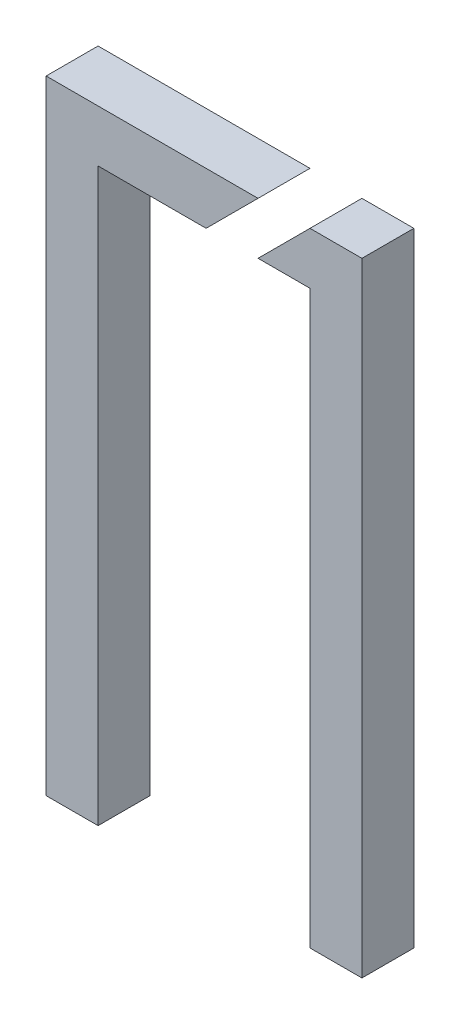
ISO-10303-21;
HEADER;
FILE_DESCRIPTION(('STEP AP214'),'2;1');
FILE_NAME('part.step','',(''),(''),'','','');
FILE_SCHEMA(('AUTOMOTIVE_DESIGN { 1 0 10303 214 1 1 1 1 }'));
ENDSEC;
DATA;
#1=APPLICATION_CONTEXT('core data for automotive mechanical design processes');
#2=APPLICATION_PROTOCOL_DEFINITION('international standard','automotive_design',2000,#1);
#3=PRODUCT_CONTEXT('',#1,'mechanical');
#4=PRODUCT('Part','Part','',(#3));
#5=PRODUCT_RELATED_PRODUCT_CATEGORY('part','',(#4));
#6=PRODUCT_DEFINITION_FORMATION('','',#4);
#7=PRODUCT_DEFINITION_CONTEXT('part definition',#1,'design');
#8=PRODUCT_DEFINITION('design','',#6,#7);
#9=PRODUCT_DEFINITION_SHAPE('','',#8);
#10=(LENGTH_UNIT() NAMED_UNIT(*) SI_UNIT(.MILLI.,.METRE.));
#11=(NAMED_UNIT(*) PLANE_ANGLE_UNIT() SI_UNIT($,.RADIAN.));
#12=(NAMED_UNIT(*) SI_UNIT($,.STERADIAN.) SOLID_ANGLE_UNIT());
#13=UNCERTAINTY_MEASURE_WITH_UNIT(LENGTH_MEASURE(1.E-05),#10,'distance_accuracy_value','');
#14=(GEOMETRIC_REPRESENTATION_CONTEXT(3) GLOBAL_UNCERTAINTY_ASSIGNED_CONTEXT((#13)) GLOBAL_UNIT_ASSIGNED_CONTEXT((#10,
#11,#12)) REPRESENTATION_CONTEXT('',''));
#15=CARTESIAN_POINT('',(0.,0.,0.));
#16=DIRECTION('',(0.,0.,1.));
#17=DIRECTION('',(1.,0.,0.));
#18=AXIS2_PLACEMENT_3D('',#15,#16,#17);
#19=CARTESIAN_POINT('',(2.04,5.5,0.5));
#20=DIRECTION('',(0.707106781186548,-0.707106781186547,0.));
#21=DIRECTION('',(0.707106781186547,0.707106781186548,0.));
#22=AXIS2_PLACEMENT_3D('',#19,#20,#21);
#23=PLANE('',#22);
#24=DIRECTION('',(-0.707106781186547,-0.707106781186548,0.));
#25=VECTOR('',#24,1.);
#26=CARTESIAN_POINT('',(2.04,5.5,0.));
#27=LINE('',#26,#25);
#28=CARTESIAN_POINT('',(2.54,6.,0.));
#29=VERTEX_POINT('',#28);
#30=CARTESIAN_POINT('',(2.04,5.5,0.));
#31=VERTEX_POINT('',#30);
#32=EDGE_CURVE('E127',#29,#31,#27,.T.);
#33=ORIENTED_EDGE('',*,*,#32,.T.);
#34=DIRECTION('',(0.,0.,-1.));
#35=VECTOR('',#34,1.);
#36=CARTESIAN_POINT('',(2.04,5.5,0.5));
#37=LINE('',#36,#35);
#38=CARTESIAN_POINT('',(2.04,5.5,0.5));
#39=VERTEX_POINT('',#38);
#40=EDGE_CURVE('E12',#39,#31,#37,.T.);
#41=ORIENTED_EDGE('',*,*,#40,.F.);
#42=DIRECTION('',(-0.707106781186547,-0.707106781186548,0.));
#43=VECTOR('',#42,1.);
#44=CARTESIAN_POINT('',(2.04,5.5,0.5));
#45=LINE('',#44,#43);
#46=CARTESIAN_POINT('',(2.54,6.,0.5));
#47=VERTEX_POINT('',#46);
#48=EDGE_CURVE('E137',#47,#39,#45,.T.);
#49=ORIENTED_EDGE('',*,*,#48,.F.);
#50=DIRECTION('',(0.,0.,-1.));
#51=VECTOR('',#50,1.);
#52=CARTESIAN_POINT('',(2.54,6.,0.5));
#53=LINE('',#52,#51);
#54=EDGE_CURVE('E123',#47,#29,#53,.T.);
#55=ORIENTED_EDGE('',*,*,#54,.T.);
#56=EDGE_LOOP('',(#33,#41,#49,#55));
#57=FACE_BOUND('',#56,.T.);
#58=ADVANCED_FACE('F43',(#57),#23,.F.);
#59=CARTESIAN_POINT('',(2.54,5.5,0.5));
#60=DIRECTION('',(0.,1.,0.));
#61=DIRECTION('',(0.,0.,1.));
#62=AXIS2_PLACEMENT_3D('',#59,#60,#61);
#63=PLANE('',#62);
#64=DIRECTION('',(1.,0.,0.));
#65=VECTOR('',#64,1.);
#66=CARTESIAN_POINT('',(2.54,5.5,0.));
#67=LINE('',#66,#65);
#68=CARTESIAN_POINT('',(2.54,5.5,0.));
#69=VERTEX_POINT('',#68);
#70=EDGE_CURVE('E130',#31,#69,#67,.T.);
#71=ORIENTED_EDGE('',*,*,#70,.T.);
#72=DIRECTION('',(0.,0.,-1.));
#73=VECTOR('',#72,1.);
#74=CARTESIAN_POINT('',(2.54,5.5,0.5));
#75=LINE('',#74,#73);
#76=CARTESIAN_POINT('',(2.54,5.5,0.5));
#77=VERTEX_POINT('',#76);
#78=EDGE_CURVE('E51',#77,#69,#75,.T.);
#79=ORIENTED_EDGE('',*,*,#78,.F.);
#80=DIRECTION('',(1.,0.,0.));
#81=VECTOR('',#80,1.);
#82=CARTESIAN_POINT('',(2.54,5.5,0.5));
#83=LINE('',#82,#81);
#84=EDGE_CURVE('E96',#39,#77,#83,.T.);
#85=ORIENTED_EDGE('',*,*,#84,.F.);
#86=ORIENTED_EDGE('',*,*,#40,.T.);
#87=EDGE_LOOP('',(#71,#79,#85,#86));
#88=FACE_BOUND('',#87,.T.);
#89=ADVANCED_FACE('F161',(#88),#63,.F.);
#90=CARTESIAN_POINT('',(2.54,0.,0.5));
#91=DIRECTION('',(1.,0.,0.));
#92=DIRECTION('',(0.,0.,-1.));
#93=AXIS2_PLACEMENT_3D('',#90,#91,#92);
#94=PLANE('',#93);
#95=DIRECTION('',(0.,-1.,0.));
#96=VECTOR('',#95,1.);
#97=CARTESIAN_POINT('',(2.54,0.,0.));
#98=LINE('',#97,#96);
#99=CARTESIAN_POINT('',(2.54,0.,0.));
#100=VERTEX_POINT('',#99);
#101=EDGE_CURVE('E132',#69,#100,#98,.T.);
#102=ORIENTED_EDGE('',*,*,#101,.T.);
#103=DIRECTION('',(0.,0.,-1.));
#104=VECTOR('',#103,1.);
#105=CARTESIAN_POINT('',(2.54,0.,0.5));
#106=LINE('',#105,#104);
#107=CARTESIAN_POINT('',(2.54,0.,0.5));
#108=VERTEX_POINT('',#107);
#109=EDGE_CURVE('E118',#108,#100,#106,.T.);
#110=ORIENTED_EDGE('',*,*,#109,.F.);
#111=DIRECTION('',(0.,-1.,0.));
#112=VECTOR('',#111,1.);
#113=CARTESIAN_POINT('',(2.54,0.,0.5));
#114=LINE('',#113,#112);
#115=EDGE_CURVE('E109',#77,#108,#114,.T.);
#116=ORIENTED_EDGE('',*,*,#115,.F.);
#117=ORIENTED_EDGE('',*,*,#78,.T.);
#118=EDGE_LOOP('',(#102,#110,#116,#117));
#119=FACE_BOUND('',#118,.T.);
#120=ADVANCED_FACE('F143',(#119),#94,.F.);
#121=CARTESIAN_POINT('',(3.04,0.,0.5));
#122=DIRECTION('',(0.,1.,0.));
#123=DIRECTION('',(-1.,0.,0.));
#124=AXIS2_PLACEMENT_3D('',#121,#122,#123);
#125=PLANE('',#124);
#126=DIRECTION('',(1.,0.,0.));
#127=VECTOR('',#126,1.);
#128=CARTESIAN_POINT('',(3.04,0.,0.));
#129=LINE('',#128,#127);
#130=CARTESIAN_POINT('',(3.04,0.,0.));
#131=VERTEX_POINT('',#130);
#132=EDGE_CURVE('E117',#100,#131,#129,.T.);
#133=ORIENTED_EDGE('',*,*,#132,.T.);
#134=DIRECTION('',(0.,0.,-1.));
#135=VECTOR('',#134,1.);
#136=CARTESIAN_POINT('',(3.04,0.,0.5));
#137=LINE('',#136,#135);
#138=CARTESIAN_POINT('',(3.04,0.,0.5));
#139=VERTEX_POINT('',#138);
#140=EDGE_CURVE('E114',#139,#131,#137,.T.);
#141=ORIENTED_EDGE('',*,*,#140,.F.);
#142=DIRECTION('',(1.,0.,0.));
#143=VECTOR('',#142,1.);
#144=CARTESIAN_POINT('',(3.04,0.,0.5));
#145=LINE('',#144,#143);
#146=EDGE_CURVE('E103',#108,#139,#145,.T.);
#147=ORIENTED_EDGE('',*,*,#146,.F.);
#148=ORIENTED_EDGE('',*,*,#109,.T.);
#149=EDGE_LOOP('',(#133,#141,#147,#148));
#150=FACE_BOUND('',#149,.T.);
#151=ADVANCED_FACE('F115',(#150),#125,.F.);
#152=CARTESIAN_POINT('',(3.04,6.,0.5));
#153=DIRECTION('',(-1.,0.,0.));
#154=DIRECTION('',(0.,-1.,0.));
#155=AXIS2_PLACEMENT_3D('',#152,#153,#154);
#156=PLANE('',#155);
#157=DIRECTION('',(0.,1.,0.));
#158=VECTOR('',#157,1.);
#159=CARTESIAN_POINT('',(3.04,6.,0.));
#160=LINE('',#159,#158);
#161=CARTESIAN_POINT('',(3.04,6.,0.));
#162=VERTEX_POINT('',#161);
#163=EDGE_CURVE('E82',#131,#162,#160,.T.);
#164=ORIENTED_EDGE('',*,*,#163,.T.);
#165=DIRECTION('',(0.,0.,-1.));
#166=VECTOR('',#165,1.);
#167=CARTESIAN_POINT('',(3.04,6.,0.5));
#168=LINE('',#167,#166);
#169=CARTESIAN_POINT('',(3.04,6.,0.5));
#170=VERTEX_POINT('',#169);
#171=EDGE_CURVE('E119',#170,#162,#168,.T.);
#172=ORIENTED_EDGE('',*,*,#171,.F.);
#173=DIRECTION('',(0.,1.,0.));
#174=VECTOR('',#173,1.);
#175=CARTESIAN_POINT('',(3.04,6.,0.5));
#176=LINE('',#175,#174);
#177=EDGE_CURVE('E107',#139,#170,#176,.T.);
#178=ORIENTED_EDGE('',*,*,#177,.F.);
#179=ORIENTED_EDGE('',*,*,#140,.T.);
#180=EDGE_LOOP('',(#164,#172,#178,#179));
#181=FACE_BOUND('',#180,.T.);
#182=ADVANCED_FACE('F121',(#181),#156,.F.);
#183=CARTESIAN_POINT('',(2.54,6.,0.5));
#184=DIRECTION('',(0.,-1.,0.));
#185=DIRECTION('',(1.,0.,0.));
#186=AXIS2_PLACEMENT_3D('',#183,#184,#185);
#187=PLANE('',#186);
#188=DIRECTION('',(-1.,0.,0.));
#189=VECTOR('',#188,1.);
#190=CARTESIAN_POINT('',(2.54,6.,0.));
#191=LINE('',#190,#189);
#192=EDGE_CURVE('E88',#162,#29,#191,.T.);
#193=ORIENTED_EDGE('',*,*,#192,.T.);
#194=ORIENTED_EDGE('',*,*,#54,.F.);
#195=DIRECTION('',(-1.,0.,0.));
#196=VECTOR('',#195,1.);
#197=CARTESIAN_POINT('',(2.54,6.,0.5));
#198=LINE('',#197,#196);
#199=EDGE_CURVE('E59',#170,#47,#198,.T.);
#200=ORIENTED_EDGE('',*,*,#199,.F.);
#201=ORIENTED_EDGE('',*,*,#171,.T.);
#202=EDGE_LOOP('',(#193,#194,#200,#201));
#203=FACE_BOUND('',#202,.T.);
#204=ADVANCED_FACE('F150',(#203),#187,.F.);
#205=CARTESIAN_POINT('',(0.,0.,0.5));
#206=DIRECTION('',(0.,0.,-1.));
#207=DIRECTION('',(-1.,0.,0.));
#208=AXIS2_PLACEMENT_3D('',#205,#206,#207);
#209=PLANE('',#208);
#210=ORIENTED_EDGE('',*,*,#48,.T.);
#211=ORIENTED_EDGE('',*,*,#84,.T.);
#212=ORIENTED_EDGE('',*,*,#115,.T.);
#213=ORIENTED_EDGE('',*,*,#146,.T.);
#214=ORIENTED_EDGE('',*,*,#177,.T.);
#215=ORIENTED_EDGE('',*,*,#199,.T.);
#216=EDGE_LOOP('',(#210,#211,#212,#213,#214,#215));
#217=FACE_BOUND('',#216,.T.);
#218=ADVANCED_FACE('F105',(#217),#209,.F.);
#219=CARTESIAN_POINT('',(0.,0.,0.));
#220=DIRECTION('',(0.,0.,-1.));
#221=DIRECTION('',(-1.,0.,0.));
#222=AXIS2_PLACEMENT_3D('',#219,#220,#221);
#223=PLANE('',#222);
#224=ORIENTED_EDGE('',*,*,#32,.F.);
#225=ORIENTED_EDGE('',*,*,#192,.F.);
#226=ORIENTED_EDGE('',*,*,#163,.F.);
#227=ORIENTED_EDGE('',*,*,#132,.F.);
#228=ORIENTED_EDGE('',*,*,#101,.F.);
#229=ORIENTED_EDGE('',*,*,#70,.F.);
#230=EDGE_LOOP('',(#224,#225,#226,#227,#228,#229));
#231=FACE_BOUND('',#230,.T.);
#232=ADVANCED_FACE('F146',(#231),#223,.T.);
#233=CLOSED_SHELL('',(#58,#89,#120,#151,#182,#204,#218,#232));
#234=MANIFOLD_SOLID_BREP('B2',#233);
#235=CARTESIAN_POINT('',(0.,6.,0.5));
#236=DIRECTION('',(0.,-1.,0.));
#237=DIRECTION('',(1.,0.,0.));
#238=AXIS2_PLACEMENT_3D('',#235,#236,#237);
#239=PLANE('',#238);
#240=DIRECTION('',(-1.,0.,0.));
#241=VECTOR('',#240,1.);
#242=CARTESIAN_POINT('',(0.,6.,0.));
#243=LINE('',#242,#241);
#244=CARTESIAN_POINT('',(2.04,6.,0.));
#245=VERTEX_POINT('',#244);
#246=CARTESIAN_POINT('',(0.,6.,0.));
#247=VERTEX_POINT('',#246);
#248=EDGE_CURVE('E303',#245,#247,#243,.T.);
#249=ORIENTED_EDGE('',*,*,#248,.T.);
#250=DIRECTION('',(0.,0.,-1.));
#251=VECTOR('',#250,1.);
#252=CARTESIAN_POINT('',(0.,6.,0.5));
#253=LINE('',#252,#251);
#254=CARTESIAN_POINT('',(0.,6.,0.5));
#255=VERTEX_POINT('',#254);
#256=EDGE_CURVE('E41',#255,#247,#253,.T.);
#257=ORIENTED_EDGE('',*,*,#256,.F.);
#258=DIRECTION('',(-1.,0.,0.));
#259=VECTOR('',#258,1.);
#260=CARTESIAN_POINT('',(0.,6.,0.5));
#261=LINE('',#260,#259);
#262=CARTESIAN_POINT('',(2.04,6.,0.5));
#263=VERTEX_POINT('',#262);
#264=EDGE_CURVE('E313',#263,#255,#261,.T.);
#265=ORIENTED_EDGE('',*,*,#264,.F.);
#266=DIRECTION('',(0.,0.,-1.));
#267=VECTOR('',#266,1.);
#268=CARTESIAN_POINT('',(2.04,6.,0.5));
#269=LINE('',#268,#267);
#270=EDGE_CURVE('E299',#263,#245,#269,.T.);
#271=ORIENTED_EDGE('',*,*,#270,.T.);
#272=EDGE_LOOP('',(#249,#257,#265,#271));
#273=FACE_BOUND('',#272,.T.);
#274=ADVANCED_FACE('F219',(#273),#239,.F.);
#275=CARTESIAN_POINT('',(0.,6.,0.5));
#276=DIRECTION('',(1.,0.,0.));
#277=DIRECTION('',(0.,1.,0.));
#278=AXIS2_PLACEMENT_3D('',#275,#276,#277);
#279=PLANE('',#278);
#280=DIRECTION('',(0.,-1.,0.));
#281=VECTOR('',#280,1.);
#282=CARTESIAN_POINT('',(0.,6.,0.));
#283=LINE('',#282,#281);
#284=CARTESIAN_POINT('',(0.,0.,0.));
#285=VERTEX_POINT('',#284);
#286=EDGE_CURVE('E306',#247,#285,#283,.T.);
#287=ORIENTED_EDGE('',*,*,#286,.T.);
#288=DIRECTION('',(0.,0.,-1.));
#289=VECTOR('',#288,1.);
#290=CARTESIAN_POINT('',(0.,0.,0.5));
#291=LINE('',#290,#289);
#292=CARTESIAN_POINT('',(0.,0.,0.5));
#293=VERTEX_POINT('',#292);
#294=EDGE_CURVE('E227',#293,#285,#291,.T.);
#295=ORIENTED_EDGE('',*,*,#294,.F.);
#296=DIRECTION('',(0.,-1.,0.));
#297=VECTOR('',#296,1.);
#298=CARTESIAN_POINT('',(0.,6.,0.5));
#299=LINE('',#298,#297);
#300=EDGE_CURVE('E272',#255,#293,#299,.T.);
#301=ORIENTED_EDGE('',*,*,#300,.F.);
#302=ORIENTED_EDGE('',*,*,#256,.T.);
#303=EDGE_LOOP('',(#287,#295,#301,#302));
#304=FACE_BOUND('',#303,.T.);
#305=ADVANCED_FACE('F337',(#304),#279,.F.);
#306=CARTESIAN_POINT('',(0.5,0.,0.5));
#307=DIRECTION('',(0.,1.,0.));
#308=DIRECTION('',(-1.,0.,0.));
#309=AXIS2_PLACEMENT_3D('',#306,#307,#308);
#310=PLANE('',#309);
#311=DIRECTION('',(1.,0.,0.));
#312=VECTOR('',#311,1.);
#313=CARTESIAN_POINT('',(0.5,0.,0.));
#314=LINE('',#313,#312);
#315=CARTESIAN_POINT('',(0.5,0.,0.));
#316=VERTEX_POINT('',#315);
#317=EDGE_CURVE('E308',#285,#316,#314,.T.);
#318=ORIENTED_EDGE('',*,*,#317,.T.);
#319=DIRECTION('',(0.,0.,-1.));
#320=VECTOR('',#319,1.);
#321=CARTESIAN_POINT('',(0.5,0.,0.5));
#322=LINE('',#321,#320);
#323=CARTESIAN_POINT('',(0.5,0.,0.5));
#324=VERTEX_POINT('',#323);
#325=EDGE_CURVE('E294',#324,#316,#322,.T.);
#326=ORIENTED_EDGE('',*,*,#325,.F.);
#327=DIRECTION('',(1.,0.,0.));
#328=VECTOR('',#327,1.);
#329=CARTESIAN_POINT('',(0.5,0.,0.5));
#330=LINE('',#329,#328);
#331=EDGE_CURVE('E285',#293,#324,#330,.T.);
#332=ORIENTED_EDGE('',*,*,#331,.F.);
#333=ORIENTED_EDGE('',*,*,#294,.T.);
#334=EDGE_LOOP('',(#318,#326,#332,#333));
#335=FACE_BOUND('',#334,.T.);
#336=ADVANCED_FACE('F319',(#335),#310,.F.);
#337=CARTESIAN_POINT('',(0.499999999999999,5.5,0.5));
#338=DIRECTION('',(-1.,0.,0.));
#339=DIRECTION('',(0.,-1.,0.));
#340=AXIS2_PLACEMENT_3D('',#337,#338,#339);
#341=PLANE('',#340);
#342=DIRECTION('',(0.,1.,0.));
#343=VECTOR('',#342,1.);
#344=CARTESIAN_POINT('',(0.499999999999999,5.5,0.));
#345=LINE('',#344,#343);
#346=CARTESIAN_POINT('',(0.499999999999999,5.5,0.));
#347=VERTEX_POINT('',#346);
#348=EDGE_CURVE('E293',#316,#347,#345,.T.);
#349=ORIENTED_EDGE('',*,*,#348,.T.);
#350=DIRECTION('',(0.,0.,-1.));
#351=VECTOR('',#350,1.);
#352=CARTESIAN_POINT('',(0.499999999999999,5.5,0.5));
#353=LINE('',#352,#351);
#354=CARTESIAN_POINT('',(0.499999999999999,5.5,0.5));
#355=VERTEX_POINT('',#354);
#356=EDGE_CURVE('E290',#355,#347,#353,.T.);
#357=ORIENTED_EDGE('',*,*,#356,.F.);
#358=DIRECTION('',(0.,1.,0.));
#359=VECTOR('',#358,1.);
#360=CARTESIAN_POINT('',(0.499999999999999,5.5,0.5));
#361=LINE('',#360,#359);
#362=EDGE_CURVE('E279',#324,#355,#361,.T.);
#363=ORIENTED_EDGE('',*,*,#362,.F.);
#364=ORIENTED_EDGE('',*,*,#325,.T.);
#365=EDGE_LOOP('',(#349,#357,#363,#364));
#366=FACE_BOUND('',#365,.T.);
#367=ADVANCED_FACE('F291',(#366),#341,.F.);
#368=CARTESIAN_POINT('',(1.54,5.5,0.5));
#369=DIRECTION('',(0.,1.,0.));
#370=DIRECTION('',(-1.,0.,0.));
#371=AXIS2_PLACEMENT_3D('',#368,#369,#370);
#372=PLANE('',#371);
#373=DIRECTION('',(1.,0.,0.));
#374=VECTOR('',#373,1.);
#375=CARTESIAN_POINT('',(1.54,5.5,0.));
#376=LINE('',#375,#374);
#377=CARTESIAN_POINT('',(1.54,5.5,0.));
#378=VERTEX_POINT('',#377);
#379=EDGE_CURVE('E258',#347,#378,#376,.T.);
#380=ORIENTED_EDGE('',*,*,#379,.T.);
#381=DIRECTION('',(0.,0.,-1.));
#382=VECTOR('',#381,1.);
#383=CARTESIAN_POINT('',(1.54,5.5,0.5));
#384=LINE('',#383,#382);
#385=CARTESIAN_POINT('',(1.54,5.5,0.5));
#386=VERTEX_POINT('',#385);
#387=EDGE_CURVE('E295',#386,#378,#384,.T.);
#388=ORIENTED_EDGE('',*,*,#387,.F.);
#389=DIRECTION('',(1.,0.,0.));
#390=VECTOR('',#389,1.);
#391=CARTESIAN_POINT('',(1.54,5.5,0.5));
#392=LINE('',#391,#390);
#393=EDGE_CURVE('E283',#355,#386,#392,.T.);
#394=ORIENTED_EDGE('',*,*,#393,.F.);
#395=ORIENTED_EDGE('',*,*,#356,.T.);
#396=EDGE_LOOP('',(#380,#388,#394,#395));
#397=FACE_BOUND('',#396,.T.);
#398=ADVANCED_FACE('F297',(#397),#372,.F.);
#399=CARTESIAN_POINT('',(2.04,6.,0.5));
#400=DIRECTION('',(-0.707106781186548,0.707106781186548,0.));
#401=DIRECTION('',(-0.707106781186548,-0.707106781186548,0.));
#402=AXIS2_PLACEMENT_3D('',#399,#400,#401);
#403=PLANE('',#402);
#404=DIRECTION('',(0.707106781186548,0.707106781186548,0.));
#405=VECTOR('',#404,1.);
#406=CARTESIAN_POINT('',(2.04,6.,0.));
#407=LINE('',#406,#405);
#408=EDGE_CURVE('E264',#378,#245,#407,.T.);
#409=ORIENTED_EDGE('',*,*,#408,.T.);
#410=ORIENTED_EDGE('',*,*,#270,.F.);
#411=DIRECTION('',(0.707106781186548,0.707106781186548,0.));
#412=VECTOR('',#411,1.);
#413=CARTESIAN_POINT('',(2.04,6.,0.5));
#414=LINE('',#413,#412);
#415=EDGE_CURVE('E235',#386,#263,#414,.T.);
#416=ORIENTED_EDGE('',*,*,#415,.F.);
#417=ORIENTED_EDGE('',*,*,#387,.T.);
#418=EDGE_LOOP('',(#409,#410,#416,#417));
#419=FACE_BOUND('',#418,.T.);
#420=ADVANCED_FACE('F326',(#419),#403,.F.);
#421=CARTESIAN_POINT('',(0.,0.,0.5));
#422=DIRECTION('',(0.,0.,-1.));
#423=DIRECTION('',(-1.,0.,0.));
#424=AXIS2_PLACEMENT_3D('',#421,#422,#423);
#425=PLANE('',#424);
#426=ORIENTED_EDGE('',*,*,#264,.T.);
#427=ORIENTED_EDGE('',*,*,#300,.T.);
#428=ORIENTED_EDGE('',*,*,#331,.T.);
#429=ORIENTED_EDGE('',*,*,#362,.T.);
#430=ORIENTED_EDGE('',*,*,#393,.T.);
#431=ORIENTED_EDGE('',*,*,#415,.T.);
#432=EDGE_LOOP('',(#426,#427,#428,#429,#430,#431));
#433=FACE_BOUND('',#432,.T.);
#434=ADVANCED_FACE('F281',(#433),#425,.F.);
#435=CARTESIAN_POINT('',(0.,0.,0.));
#436=DIRECTION('',(0.,0.,-1.));
#437=DIRECTION('',(-1.,0.,0.));
#438=AXIS2_PLACEMENT_3D('',#435,#436,#437);
#439=PLANE('',#438);
#440=ORIENTED_EDGE('',*,*,#248,.F.);
#441=ORIENTED_EDGE('',*,*,#408,.F.);
#442=ORIENTED_EDGE('',*,*,#379,.F.);
#443=ORIENTED_EDGE('',*,*,#348,.F.);
#444=ORIENTED_EDGE('',*,*,#317,.F.);
#445=ORIENTED_EDGE('',*,*,#286,.F.);
#446=EDGE_LOOP('',(#440,#441,#442,#443,#444,#445));
#447=FACE_BOUND('',#446,.T.);
#448=ADVANCED_FACE('F322',(#447),#439,.T.);
#449=CLOSED_SHELL('',(#274,#305,#336,#367,#398,#420,#434,#448));
#450=MANIFOLD_SOLID_BREP('B6',#449);
#451=ADVANCED_BREP_SHAPE_REPRESENTATION('',(#18,#234,#450),#14);
#452=SHAPE_DEFINITION_REPRESENTATION(#9,#451);
ENDSEC;
END-ISO-10303-21;
